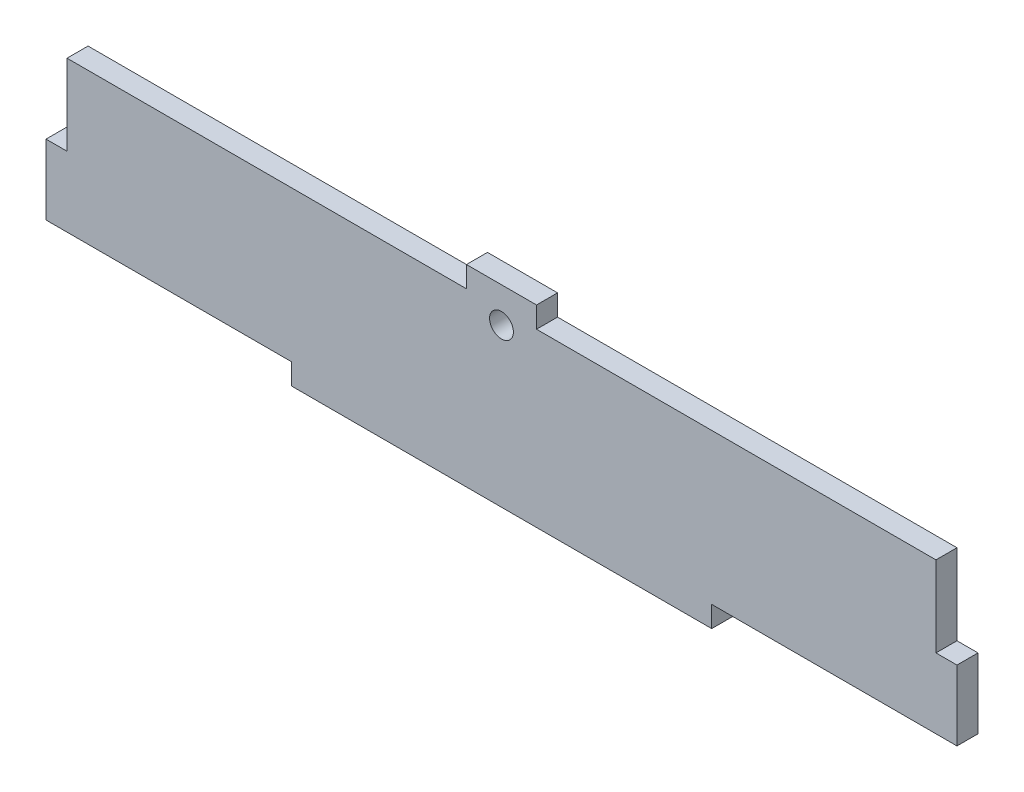
ISO-10303-21;
HEADER;
FILE_DESCRIPTION(('STEP AP214'),'2;1');
FILE_NAME('part.step','',(''),(''),'','','');
FILE_SCHEMA(('AUTOMOTIVE_DESIGN { 1 0 10303 214 1 1 1 1 }'));
ENDSEC;
DATA;
#1=APPLICATION_CONTEXT('core data for automotive mechanical design processes');
#2=APPLICATION_PROTOCOL_DEFINITION('international standard','automotive_design',2000,#1);
#3=PRODUCT_CONTEXT('',#1,'mechanical');
#4=PRODUCT('Part','Part','',(#3));
#5=PRODUCT_RELATED_PRODUCT_CATEGORY('part','',(#4));
#6=PRODUCT_DEFINITION_FORMATION('','',#4);
#7=PRODUCT_DEFINITION_CONTEXT('part definition',#1,'design');
#8=PRODUCT_DEFINITION('design','',#6,#7);
#9=PRODUCT_DEFINITION_SHAPE('','',#8);
#10=(LENGTH_UNIT() NAMED_UNIT(*) SI_UNIT(.MILLI.,.METRE.));
#11=(NAMED_UNIT(*) PLANE_ANGLE_UNIT() SI_UNIT($,.RADIAN.));
#12=(NAMED_UNIT(*) SI_UNIT($,.STERADIAN.) SOLID_ANGLE_UNIT());
#13=UNCERTAINTY_MEASURE_WITH_UNIT(LENGTH_MEASURE(1.E-05),#10,'distance_accuracy_value','');
#14=(GEOMETRIC_REPRESENTATION_CONTEXT(3) GLOBAL_UNCERTAINTY_ASSIGNED_CONTEXT((#13)) GLOBAL_UNIT_ASSIGNED_CONTEXT((#10,
#11,#12)) REPRESENTATION_CONTEXT('',''));
#15=CARTESIAN_POINT('',(0.,0.,0.));
#16=DIRECTION('',(0.,0.,1.));
#17=DIRECTION('',(1.,0.,0.));
#18=AXIS2_PLACEMENT_3D('',#15,#16,#17);
#19=CARTESIAN_POINT('',(130.,0.,6.));
#20=DIRECTION('',(0.,1.,0.));
#21=DIRECTION('',(0.,0.,1.));
#22=AXIS2_PLACEMENT_3D('',#19,#20,#21);
#23=PLANE('',#22);
#24=DIRECTION('',(0.,0.,-1.));
#25=VECTOR('',#24,1.);
#26=CARTESIAN_POINT('',(-60.,0.,6.));
#27=LINE('',#26,#25);
#28=CARTESIAN_POINT('',(-60.,0.,6.));
#29=VERTEX_POINT('',#28);
#30=CARTESIAN_POINT('',(-60.,0.,0.));
#31=VERTEX_POINT('',#30);
#32=EDGE_CURVE('E267',#29,#31,#27,.T.);
#33=ORIENTED_EDGE('',*,*,#32,.F.);
#34=DIRECTION('',(1.,0.,0.));
#35=VECTOR('',#34,1.);
#36=CARTESIAN_POINT('',(130.,0.,6.));
#37=LINE('',#36,#35);
#38=CARTESIAN_POINT('',(-130.,0.,6.));
#39=VERTEX_POINT('',#38);
#40=EDGE_CURVE('E231',#39,#29,#37,.T.);
#41=ORIENTED_EDGE('',*,*,#40,.F.);
#42=DIRECTION('',(0.,0.,-1.));
#43=VECTOR('',#42,1.);
#44=CARTESIAN_POINT('',(-130.,0.,6.));
#45=LINE('',#44,#43);
#46=CARTESIAN_POINT('',(-130.,0.,0.));
#47=VERTEX_POINT('',#46);
#48=EDGE_CURVE('E12',#39,#47,#45,.T.);
#49=ORIENTED_EDGE('',*,*,#48,.T.);
#50=DIRECTION('',(1.,0.,0.));
#51=VECTOR('',#50,1.);
#52=CARTESIAN_POINT('',(130.,0.,0.));
#53=LINE('',#52,#51);
#54=EDGE_CURVE('E386',#47,#31,#53,.T.);
#55=ORIENTED_EDGE('',*,*,#54,.T.);
#56=EDGE_LOOP('',(#33,#41,#49,#55));
#57=FACE_BOUND('',#56,.T.);
#58=ADVANCED_FACE('F43',(#57),#23,.F.);
#59=CARTESIAN_POINT('',(130.,48.9999999999999,6.));
#60=DIRECTION('',(-1.,0.,0.));
#61=DIRECTION('',(0.,-1.,0.));
#62=AXIS2_PLACEMENT_3D('',#59,#60,#61);
#63=PLANE('',#62);
#64=DIRECTION('',(0.,1.,0.));
#65=VECTOR('',#64,1.);
#66=CARTESIAN_POINT('',(130.,48.9999999999999,0.));
#67=LINE('',#66,#65);
#68=CARTESIAN_POINT('',(130.,0.,0.));
#69=VERTEX_POINT('',#68);
#70=CARTESIAN_POINT('',(130.,20.,0.));
#71=VERTEX_POINT('',#70);
#72=EDGE_CURVE('E240',#69,#71,#67,.T.);
#73=ORIENTED_EDGE('',*,*,#72,.T.);
#74=DIRECTION('',(0.,0.,-1.));
#75=VECTOR('',#74,1.);
#76=CARTESIAN_POINT('',(130.,20.,6.001));
#77=LINE('',#76,#75);
#78=CARTESIAN_POINT('',(130.,20.,6.));
#79=VERTEX_POINT('',#78);
#80=EDGE_CURVE('E705',#79,#71,#77,.T.);
#81=ORIENTED_EDGE('',*,*,#80,.F.);
#82=DIRECTION('',(0.,1.,0.));
#83=VECTOR('',#82,1.);
#84=CARTESIAN_POINT('',(130.,48.9999999999999,6.));
#85=LINE('',#84,#83);
#86=CARTESIAN_POINT('',(130.,0.,6.));
#87=VERTEX_POINT('',#86);
#88=EDGE_CURVE('E355',#87,#79,#85,.T.);
#89=ORIENTED_EDGE('',*,*,#88,.F.);
#90=DIRECTION('',(0.,0.,-1.));
#91=VECTOR('',#90,1.);
#92=CARTESIAN_POINT('',(130.,0.,6.));
#93=LINE('',#92,#91);
#94=EDGE_CURVE('E53',#87,#69,#93,.T.);
#95=ORIENTED_EDGE('',*,*,#94,.T.);
#96=EDGE_LOOP('',(#73,#81,#89,#95));
#97=FACE_BOUND('',#96,.T.);
#98=ADVANCED_FACE('F46',(#97),#63,.F.);
#99=CARTESIAN_POINT('',(130.,48.9999999999999,6.));
#100=DIRECTION('',(0.,-1.,0.));
#101=DIRECTION('',(0.,0.,-1.));
#102=AXIS2_PLACEMENT_3D('',#99,#100,#101);
#103=PLANE('',#102);
#104=DIRECTION('',(-1.,0.,0.));
#105=VECTOR('',#104,1.);
#106=CARTESIAN_POINT('',(130.,48.9999999999999,6.));
#107=LINE('',#106,#105);
#108=CARTESIAN_POINT('',(10.,48.9999999999999,6.));
#109=VERTEX_POINT('',#108);
#110=CARTESIAN_POINT('',(-10.,48.9999999999999,6.));
#111=VERTEX_POINT('',#110);
#112=EDGE_CURVE('E420',#109,#111,#107,.T.);
#113=ORIENTED_EDGE('',*,*,#112,.F.);
#114=DIRECTION('',(0.,0.,-1.));
#115=VECTOR('',#114,1.);
#116=CARTESIAN_POINT('',(10.,48.9999999999999,6.));
#117=LINE('',#116,#115);
#118=CARTESIAN_POINT('',(10.,48.9999999999999,0.));
#119=VERTEX_POINT('',#118);
#120=EDGE_CURVE('E330',#109,#119,#117,.T.);
#121=ORIENTED_EDGE('',*,*,#120,.T.);
#122=DIRECTION('',(-1.,0.,0.));
#123=VECTOR('',#122,1.);
#124=CARTESIAN_POINT('',(130.,48.9999999999999,0.));
#125=LINE('',#124,#123);
#126=CARTESIAN_POINT('',(-10.,48.9999999999999,0.));
#127=VERTEX_POINT('',#126);
#128=EDGE_CURVE('E378',#119,#127,#125,.T.);
#129=ORIENTED_EDGE('',*,*,#128,.T.);
#130=DIRECTION('',(0.,0.,-1.));
#131=VECTOR('',#130,1.);
#132=CARTESIAN_POINT('',(-10.,48.9999999999999,6.));
#133=LINE('',#132,#131);
#134=EDGE_CURVE('E316',#111,#127,#133,.T.);
#135=ORIENTED_EDGE('',*,*,#134,.F.);
#136=EDGE_LOOP('',(#113,#121,#129,#135));
#137=FACE_BOUND('',#136,.T.);
#138=ADVANCED_FACE('F417',(#137),#103,.F.);
#139=CARTESIAN_POINT('',(-130.,48.9999999999999,6.));
#140=DIRECTION('',(1.,0.,0.));
#141=DIRECTION('',(0.,1.,0.));
#142=AXIS2_PLACEMENT_3D('',#139,#140,#141);
#143=PLANE('',#142);
#144=DIRECTION('',(0.,-1.,0.));
#145=VECTOR('',#144,1.);
#146=CARTESIAN_POINT('',(-130.,48.9999999999999,6.));
#147=LINE('',#146,#145);
#148=CARTESIAN_POINT('',(-130.,20.,6.));
#149=VERTEX_POINT('',#148);
#150=EDGE_CURVE('E237',#149,#39,#147,.T.);
#151=ORIENTED_EDGE('',*,*,#150,.F.);
#152=DIRECTION('',(0.,0.,-1.));
#153=VECTOR('',#152,1.);
#154=CARTESIAN_POINT('',(-130.,20.,6.001));
#155=LINE('',#154,#153);
#156=CARTESIAN_POINT('',(-130.,20.,0.));
#157=VERTEX_POINT('',#156);
#158=EDGE_CURVE('E286',#149,#157,#155,.T.);
#159=ORIENTED_EDGE('',*,*,#158,.T.);
#160=DIRECTION('',(0.,-1.,0.));
#161=VECTOR('',#160,1.);
#162=CARTESIAN_POINT('',(-130.,48.9999999999999,0.));
#163=LINE('',#162,#161);
#164=EDGE_CURVE('E382',#157,#47,#163,.T.);
#165=ORIENTED_EDGE('',*,*,#164,.T.);
#166=ORIENTED_EDGE('',*,*,#48,.F.);
#167=EDGE_LOOP('',(#151,#159,#165,#166));
#168=FACE_BOUND('',#167,.T.);
#169=ADVANCED_FACE('F469',(#168),#143,.F.);
#170=CARTESIAN_POINT('',(60.,0.,6.));
#171=VERTEX_POINT('',#170);
#172=EDGE_CURVE('E236',#171,#87,#37,.T.);
#173=ORIENTED_EDGE('',*,*,#172,.F.);
#174=DIRECTION('',(0.,0.,-1.));
#175=VECTOR('',#174,1.);
#176=CARTESIAN_POINT('',(60.,0.,6.));
#177=LINE('',#176,#175);
#178=CARTESIAN_POINT('',(60.,0.,0.));
#179=VERTEX_POINT('',#178);
#180=EDGE_CURVE('E212',#171,#179,#177,.T.);
#181=ORIENTED_EDGE('',*,*,#180,.T.);
#182=EDGE_CURVE('E385',#179,#69,#53,.T.);
#183=ORIENTED_EDGE('',*,*,#182,.T.);
#184=ORIENTED_EDGE('',*,*,#94,.F.);
#185=EDGE_LOOP('',(#173,#181,#183,#184));
#186=FACE_BOUND('',#185,.T.);
#187=ADVANCED_FACE('F456',(#186),#23,.F.);
#188=CARTESIAN_POINT('',(0.,0.,6.));
#189=DIRECTION('',(0.,0.,-1.));
#190=DIRECTION('',(-1.,0.,0.));
#191=AXIS2_PLACEMENT_3D('',#188,#189,#190);
#192=PLANE('',#191);
#193=CARTESIAN_POINT('',(0.,39.,6.));
#194=DIRECTION('',(0.,0.,-1.));
#195=DIRECTION('',(-1.,0.,0.));
#196=AXIS2_PLACEMENT_3D('',#193,#194,#195);
#197=CIRCLE('',#196,3.4);
#198=CARTESIAN_POINT('',(-3.39999999999995,39.,6.));
#199=VERTEX_POINT('',#198);
#200=EDGE_CURVE('E304',#199,#199,#197,.T.);
#201=ORIENTED_EDGE('',*,*,#200,.T.);
#202=EDGE_LOOP('',(#201));
#203=FACE_BOUND('',#202,.T.);
#204=DIRECTION('',(1.,0.,0.));
#205=VECTOR('',#204,1.);
#206=CARTESIAN_POINT('',(130.,20.,6.));
#207=LINE('',#206,#205);
#208=CARTESIAN_POINT('',(124.,20.,6.));
#209=VERTEX_POINT('',#208);
#210=EDGE_CURVE('E374',#209,#79,#207,.T.);
#211=ORIENTED_EDGE('',*,*,#210,.F.);
#212=DIRECTION('',(0.,-1.,0.));
#213=VECTOR('',#212,1.);
#214=CARTESIAN_POINT('',(124.,43.,6.));
#215=LINE('',#214,#213);
#216=CARTESIAN_POINT('',(124.,43.,6.));
#217=VERTEX_POINT('',#216);
#218=EDGE_CURVE('E280',#217,#209,#215,.T.);
#219=ORIENTED_EDGE('',*,*,#218,.F.);
#220=DIRECTION('',(-1.,0.,0.));
#221=VECTOR('',#220,1.);
#222=CARTESIAN_POINT('',(130.,43.,6.));
#223=LINE('',#222,#221);
#224=CARTESIAN_POINT('',(10.,43.,6.));
#225=VERTEX_POINT('',#224);
#226=EDGE_CURVE('E298',#217,#225,#223,.T.);
#227=ORIENTED_EDGE('',*,*,#226,.T.);
#228=DIRECTION('',(0.,1.,0.));
#229=VECTOR('',#228,1.);
#230=CARTESIAN_POINT('',(10.,48.9999999999999,6.));
#231=LINE('',#230,#229);
#232=EDGE_CURVE('E302',#225,#109,#231,.T.);
#233=ORIENTED_EDGE('',*,*,#232,.T.);
#234=ORIENTED_EDGE('',*,*,#112,.T.);
#235=DIRECTION('',(0.,-1.,0.));
#236=VECTOR('',#235,1.);
#237=CARTESIAN_POINT('',(-10.,43.,6.));
#238=LINE('',#237,#236);
#239=CARTESIAN_POINT('',(-10.,43.,6.));
#240=VERTEX_POINT('',#239);
#241=EDGE_CURVE('E332',#111,#240,#238,.T.);
#242=ORIENTED_EDGE('',*,*,#241,.T.);
#243=DIRECTION('',(-1.,0.,0.));
#244=VECTOR('',#243,1.);
#245=CARTESIAN_POINT('',(-10.,43.,6.));
#246=LINE('',#245,#244);
#247=CARTESIAN_POINT('',(-124.,43.,6.));
#248=VERTEX_POINT('',#247);
#249=EDGE_CURVE('E337',#240,#248,#246,.T.);
#250=ORIENTED_EDGE('',*,*,#249,.T.);
#251=DIRECTION('',(0.,1.,0.));
#252=VECTOR('',#251,1.);
#253=CARTESIAN_POINT('',(-124.,43.,6.));
#254=LINE('',#253,#252);
#255=CARTESIAN_POINT('',(-124.,20.,6.));
#256=VERTEX_POINT('',#255);
#257=EDGE_CURVE('E74',#256,#248,#254,.T.);
#258=ORIENTED_EDGE('',*,*,#257,.F.);
#259=DIRECTION('',(1.,0.,0.));
#260=VECTOR('',#259,1.);
#261=CARTESIAN_POINT('',(-130.,20.,6.));
#262=LINE('',#261,#260);
#263=EDGE_CURVE('E486',#149,#256,#262,.T.);
#264=ORIENTED_EDGE('',*,*,#263,.F.);
#265=ORIENTED_EDGE('',*,*,#150,.T.);
#266=ORIENTED_EDGE('',*,*,#40,.T.);
#267=DIRECTION('',(0.,1.,0.));
#268=VECTOR('',#267,1.);
#269=CARTESIAN_POINT('',(-60.,0.,6.));
#270=LINE('',#269,#268);
#271=CARTESIAN_POINT('',(-60.,-5.99999999999998,6.));
#272=VERTEX_POINT('',#271);
#273=EDGE_CURVE('E199',#272,#29,#270,.T.);
#274=ORIENTED_EDGE('',*,*,#273,.F.);
#275=DIRECTION('',(-1.,0.,0.));
#276=VECTOR('',#275,1.);
#277=CARTESIAN_POINT('',(60.,-6.,6.));
#278=LINE('',#277,#276);
#279=CARTESIAN_POINT('',(60.,-6.,6.));
#280=VERTEX_POINT('',#279);
#281=EDGE_CURVE('E193',#280,#272,#278,.T.);
#282=ORIENTED_EDGE('',*,*,#281,.F.);
#283=DIRECTION('',(0.,-1.,0.));
#284=VECTOR('',#283,1.);
#285=CARTESIAN_POINT('',(60.,0.,6.));
#286=LINE('',#285,#284);
#287=EDGE_CURVE('E206',#171,#280,#286,.T.);
#288=ORIENTED_EDGE('',*,*,#287,.F.);
#289=ORIENTED_EDGE('',*,*,#172,.T.);
#290=ORIENTED_EDGE('',*,*,#88,.T.);
#291=EDGE_LOOP('',(#211,#219,#227,#233,#234,#242,#250,#258,#264,#265,#266,#274,#282,#288,#289,#290));
#292=FACE_BOUND('',#291,.T.);
#293=ADVANCED_FACE('F205',(#203,#292),#192,.F.);
#294=CARTESIAN_POINT('',(0.,0.,0.));
#295=DIRECTION('',(0.,0.,-1.));
#296=DIRECTION('',(-1.,0.,0.));
#297=AXIS2_PLACEMENT_3D('',#294,#295,#296);
#298=PLANE('',#297);
#299=DIRECTION('',(0.,1.,0.));
#300=VECTOR('',#299,1.);
#301=CARTESIAN_POINT('',(124.,43.,0.));
#302=LINE('',#301,#300);
#303=CARTESIAN_POINT('',(124.,20.,0.));
#304=VERTEX_POINT('',#303);
#305=CARTESIAN_POINT('',(124.,43.,0.));
#306=VERTEX_POINT('',#305);
#307=EDGE_CURVE('E702',#304,#306,#302,.T.);
#308=ORIENTED_EDGE('',*,*,#307,.F.);
#309=DIRECTION('',(-1.,0.,0.));
#310=VECTOR('',#309,1.);
#311=CARTESIAN_POINT('',(130.,20.,0.));
#312=LINE('',#311,#310);
#313=EDGE_CURVE('E285',#71,#304,#312,.T.);
#314=ORIENTED_EDGE('',*,*,#313,.F.);
#315=ORIENTED_EDGE('',*,*,#72,.F.);
#316=ORIENTED_EDGE('',*,*,#182,.F.);
#317=DIRECTION('',(0.,-1.,0.));
#318=VECTOR('',#317,1.);
#319=CARTESIAN_POINT('',(60.,0.,0.));
#320=LINE('',#319,#318);
#321=CARTESIAN_POINT('',(60.,-6.,0.));
#322=VERTEX_POINT('',#321);
#323=EDGE_CURVE('E63',#179,#322,#320,.T.);
#324=ORIENTED_EDGE('',*,*,#323,.T.);
#325=DIRECTION('',(-1.,0.,0.));
#326=VECTOR('',#325,1.);
#327=CARTESIAN_POINT('',(60.,-6.,0.));
#328=LINE('',#327,#326);
#329=CARTESIAN_POINT('',(-60.,-5.99999999999998,0.));
#330=VERTEX_POINT('',#329);
#331=EDGE_CURVE('E195',#322,#330,#328,.T.);
#332=ORIENTED_EDGE('',*,*,#331,.T.);
#333=DIRECTION('',(0.,1.,0.));
#334=VECTOR('',#333,1.);
#335=CARTESIAN_POINT('',(-60.,0.,0.));
#336=LINE('',#335,#334);
#337=EDGE_CURVE('E214',#330,#31,#336,.T.);
#338=ORIENTED_EDGE('',*,*,#337,.T.);
#339=ORIENTED_EDGE('',*,*,#54,.F.);
#340=ORIENTED_EDGE('',*,*,#164,.F.);
#341=DIRECTION('',(-1.,0.,0.));
#342=VECTOR('',#341,1.);
#343=CARTESIAN_POINT('',(-130.,20.,0.));
#344=LINE('',#343,#342);
#345=CARTESIAN_POINT('',(-124.,20.,0.));
#346=VERTEX_POINT('',#345);
#347=EDGE_CURVE('E367',#346,#157,#344,.T.);
#348=ORIENTED_EDGE('',*,*,#347,.F.);
#349=DIRECTION('',(0.,-1.,0.));
#350=VECTOR('',#349,1.);
#351=CARTESIAN_POINT('',(-124.,43.,0.));
#352=LINE('',#351,#350);
#353=CARTESIAN_POINT('',(-124.,43.,0.));
#354=VERTEX_POINT('',#353);
#355=EDGE_CURVE('E491',#354,#346,#352,.T.);
#356=ORIENTED_EDGE('',*,*,#355,.F.);
#357=DIRECTION('',(-1.,0.,0.));
#358=VECTOR('',#357,1.);
#359=CARTESIAN_POINT('',(-10.,43.,0.));
#360=LINE('',#359,#358);
#361=CARTESIAN_POINT('',(-10.,43.,0.));
#362=VERTEX_POINT('',#361);
#363=EDGE_CURVE('E338',#362,#354,#360,.T.);
#364=ORIENTED_EDGE('',*,*,#363,.F.);
#365=DIRECTION('',(0.,-1.,0.));
#366=VECTOR('',#365,1.);
#367=CARTESIAN_POINT('',(-10.,43.,0.));
#368=LINE('',#367,#366);
#369=EDGE_CURVE('E427',#127,#362,#368,.T.);
#370=ORIENTED_EDGE('',*,*,#369,.F.);
#371=ORIENTED_EDGE('',*,*,#128,.F.);
#372=DIRECTION('',(0.,1.,0.));
#373=VECTOR('',#372,1.);
#374=CARTESIAN_POINT('',(10.,48.9999999999999,0.));
#375=LINE('',#374,#373);
#376=CARTESIAN_POINT('',(10.,43.,0.));
#377=VERTEX_POINT('',#376);
#378=EDGE_CURVE('E303',#377,#119,#375,.T.);
#379=ORIENTED_EDGE('',*,*,#378,.F.);
#380=DIRECTION('',(-1.,0.,0.));
#381=VECTOR('',#380,1.);
#382=CARTESIAN_POINT('',(130.,43.,0.));
#383=LINE('',#382,#381);
#384=EDGE_CURVE('E312',#306,#377,#383,.T.);
#385=ORIENTED_EDGE('',*,*,#384,.F.);
#386=EDGE_LOOP('',(#308,#314,#315,#316,#324,#332,#338,#339,#340,#348,#356,#364,#370,#371,#379,#385));
#387=FACE_BOUND('',#386,.T.);
#388=CARTESIAN_POINT('',(0.,39.,0.));
#389=DIRECTION('',(0.,0.,-1.));
#390=DIRECTION('',(-1.,0.,0.));
#391=AXIS2_PLACEMENT_3D('',#388,#389,#390);
#392=CIRCLE('',#391,3.39999999999999);
#393=CARTESIAN_POINT('',(-3.39999999999995,39.,0.));
#394=VERTEX_POINT('',#393);
#395=EDGE_CURVE('E370',#394,#394,#392,.T.);
#396=ORIENTED_EDGE('',*,*,#395,.F.);
#397=EDGE_LOOP('',(#396));
#398=FACE_BOUND('',#397,.T.);
#399=ADVANCED_FACE('F406',(#387,#398),#298,.T.);
#400=CARTESIAN_POINT('',(-10.,43.,6.));
#401=DIRECTION('',(1.,0.,0.));
#402=DIRECTION('',(0.,0.,-1.));
#403=AXIS2_PLACEMENT_3D('',#400,#401,#402);
#404=PLANE('',#403);
#405=ORIENTED_EDGE('',*,*,#369,.T.);
#406=DIRECTION('',(0.,0.,-1.));
#407=VECTOR('',#406,1.);
#408=CARTESIAN_POINT('',(-10.,43.,6.));
#409=LINE('',#408,#407);
#410=EDGE_CURVE('E350',#240,#362,#409,.T.);
#411=ORIENTED_EDGE('',*,*,#410,.F.);
#412=ORIENTED_EDGE('',*,*,#241,.F.);
#413=ORIENTED_EDGE('',*,*,#134,.T.);
#414=EDGE_LOOP('',(#405,#411,#412,#413));
#415=FACE_BOUND('',#414,.T.);
#416=ADVANCED_FACE('F448',(#415),#404,.F.);
#417=CARTESIAN_POINT('',(-10.,43.,6.));
#418=DIRECTION('',(0.,-1.,0.));
#419=DIRECTION('',(0.,0.,-1.));
#420=AXIS2_PLACEMENT_3D('',#417,#418,#419);
#421=PLANE('',#420);
#422=ORIENTED_EDGE('',*,*,#363,.T.);
#423=DIRECTION('',(0.,0.,-1.));
#424=VECTOR('',#423,1.);
#425=CARTESIAN_POINT('',(-124.,43.,6.001));
#426=LINE('',#425,#424);
#427=EDGE_CURVE('E362',#248,#354,#426,.T.);
#428=ORIENTED_EDGE('',*,*,#427,.F.);
#429=ORIENTED_EDGE('',*,*,#249,.F.);
#430=ORIENTED_EDGE('',*,*,#410,.T.);
#431=EDGE_LOOP('',(#422,#428,#429,#430));
#432=FACE_BOUND('',#431,.T.);
#433=ADVANCED_FACE('F454',(#432),#421,.F.);
#434=CARTESIAN_POINT('',(10.,48.9999999999999,6.));
#435=DIRECTION('',(-1.,0.,0.));
#436=DIRECTION('',(0.,0.,1.));
#437=AXIS2_PLACEMENT_3D('',#434,#435,#436);
#438=PLANE('',#437);
#439=ORIENTED_EDGE('',*,*,#378,.T.);
#440=ORIENTED_EDGE('',*,*,#120,.F.);
#441=ORIENTED_EDGE('',*,*,#232,.F.);
#442=DIRECTION('',(0.,0.,-1.));
#443=VECTOR('',#442,1.);
#444=CARTESIAN_POINT('',(10.,43.,6.));
#445=LINE('',#444,#443);
#446=EDGE_CURVE('E311',#225,#377,#445,.T.);
#447=ORIENTED_EDGE('',*,*,#446,.T.);
#448=EDGE_LOOP('',(#439,#440,#441,#447));
#449=FACE_BOUND('',#448,.T.);
#450=ADVANCED_FACE('F550',(#449),#438,.F.);
#451=CARTESIAN_POINT('',(130.,43.,6.));
#452=DIRECTION('',(0.,-1.,0.));
#453=DIRECTION('',(0.,0.,-1.));
#454=AXIS2_PLACEMENT_3D('',#451,#452,#453);
#455=PLANE('',#454);
#456=ORIENTED_EDGE('',*,*,#226,.F.);
#457=DIRECTION('',(0.,0.,-1.));
#458=VECTOR('',#457,1.);
#459=CARTESIAN_POINT('',(124.,43.,6.001));
#460=LINE('',#459,#458);
#461=EDGE_CURVE('E699',#217,#306,#460,.T.);
#462=ORIENTED_EDGE('',*,*,#461,.T.);
#463=ORIENTED_EDGE('',*,*,#384,.T.);
#464=ORIENTED_EDGE('',*,*,#446,.F.);
#465=EDGE_LOOP('',(#456,#462,#463,#464));
#466=FACE_BOUND('',#465,.T.);
#467=ADVANCED_FACE('F444',(#466),#455,.F.);
#468=CARTESIAN_POINT('',(0.,39.,0.));
#469=DIRECTION('',(0.,0.,-1.));
#470=DIRECTION('',(-1.,0.,0.));
#471=AXIS2_PLACEMENT_3D('',#468,#469,#470);
#472=CYLINDRICAL_SURFACE('',#471,3.39999999999999);
#473=ORIENTED_EDGE('',*,*,#200,.F.);
#474=EDGE_LOOP('',(#473));
#475=FACE_BOUND('',#474,.T.);
#476=ORIENTED_EDGE('',*,*,#395,.T.);
#477=EDGE_LOOP('',(#476));
#478=FACE_BOUND('',#477,.T.);
#479=ADVANCED_FACE('F440',(#475,#478),#472,.F.);
#480=CARTESIAN_POINT('',(124.,43.,6.001));
#481=DIRECTION('',(-1.,0.,0.));
#482=DIRECTION('',(0.,0.,1.));
#483=AXIS2_PLACEMENT_3D('',#480,#481,#482);
#484=PLANE('',#483);
#485=ORIENTED_EDGE('',*,*,#218,.T.);
#486=DIRECTION('',(0.,0.,-1.));
#487=VECTOR('',#486,1.);
#488=CARTESIAN_POINT('',(124.,20.,6.001));
#489=LINE('',#488,#487);
#490=EDGE_CURVE('E701',#209,#304,#489,.T.);
#491=ORIENTED_EDGE('',*,*,#490,.T.);
#492=ORIENTED_EDGE('',*,*,#307,.T.);
#493=ORIENTED_EDGE('',*,*,#461,.F.);
#494=EDGE_LOOP('',(#485,#491,#492,#493));
#495=FACE_BOUND('',#494,.T.);
#496=ADVANCED_FACE('F443',(#495),#484,.F.);
#497=CARTESIAN_POINT('',(130.,20.,6.001));
#498=DIRECTION('',(0.,-1.,0.));
#499=DIRECTION('',(0.,0.,-1.));
#500=AXIS2_PLACEMENT_3D('',#497,#498,#499);
#501=PLANE('',#500);
#502=ORIENTED_EDGE('',*,*,#210,.T.);
#503=ORIENTED_EDGE('',*,*,#80,.T.);
#504=ORIENTED_EDGE('',*,*,#313,.T.);
#505=ORIENTED_EDGE('',*,*,#490,.F.);
#506=EDGE_LOOP('',(#502,#503,#504,#505));
#507=FACE_BOUND('',#506,.T.);
#508=ADVANCED_FACE('F538',(#507),#501,.F.);
#509=CARTESIAN_POINT('',(-130.,20.,6.001));
#510=DIRECTION('',(0.,-1.,0.));
#511=DIRECTION('',(0.,0.,-1.));
#512=AXIS2_PLACEMENT_3D('',#509,#510,#511);
#513=PLANE('',#512);
#514=ORIENTED_EDGE('',*,*,#263,.T.);
#515=DIRECTION('',(0.,0.,-1.));
#516=VECTOR('',#515,1.);
#517=CARTESIAN_POINT('',(-124.,20.,6.001));
#518=LINE('',#517,#516);
#519=EDGE_CURVE('E366',#256,#346,#518,.T.);
#520=ORIENTED_EDGE('',*,*,#519,.T.);
#521=ORIENTED_EDGE('',*,*,#347,.T.);
#522=ORIENTED_EDGE('',*,*,#158,.F.);
#523=EDGE_LOOP('',(#514,#520,#521,#522));
#524=FACE_BOUND('',#523,.T.);
#525=ADVANCED_FACE('F506',(#524),#513,.F.);
#526=CARTESIAN_POINT('',(-124.,43.,6.001));
#527=DIRECTION('',(1.,0.,0.));
#528=DIRECTION('',(0.,0.,-1.));
#529=AXIS2_PLACEMENT_3D('',#526,#527,#528);
#530=PLANE('',#529);
#531=ORIENTED_EDGE('',*,*,#257,.T.);
#532=ORIENTED_EDGE('',*,*,#427,.T.);
#533=ORIENTED_EDGE('',*,*,#355,.T.);
#534=ORIENTED_EDGE('',*,*,#519,.F.);
#535=EDGE_LOOP('',(#531,#532,#533,#534));
#536=FACE_BOUND('',#535,.T.);
#537=ADVANCED_FACE('F508',(#536),#530,.F.);
#538=CARTESIAN_POINT('',(60.,0.,6.));
#539=DIRECTION('',(1.,0.,0.));
#540=DIRECTION('',(0.,0.,-1.));
#541=AXIS2_PLACEMENT_3D('',#538,#539,#540);
#542=PLANE('',#541);
#543=ORIENTED_EDGE('',*,*,#323,.F.);
#544=ORIENTED_EDGE('',*,*,#180,.F.);
#545=ORIENTED_EDGE('',*,*,#287,.T.);
#546=DIRECTION('',(0.,0.,-1.));
#547=VECTOR('',#546,1.);
#548=CARTESIAN_POINT('',(60.,-6.,6.));
#549=LINE('',#548,#547);
#550=EDGE_CURVE('E190',#280,#322,#549,.T.);
#551=ORIENTED_EDGE('',*,*,#550,.T.);
#552=EDGE_LOOP('',(#543,#544,#545,#551));
#553=FACE_BOUND('',#552,.T.);
#554=ADVANCED_FACE('F211',(#553),#542,.T.);
#555=CARTESIAN_POINT('',(-60.,0.,6.));
#556=DIRECTION('',(-1.,0.,0.));
#557=DIRECTION('',(0.,0.,1.));
#558=AXIS2_PLACEMENT_3D('',#555,#556,#557);
#559=PLANE('',#558);
#560=ORIENTED_EDGE('',*,*,#337,.F.);
#561=DIRECTION('',(0.,0.,-1.));
#562=VECTOR('',#561,1.);
#563=CARTESIAN_POINT('',(-60.,-5.99999999999998,6.));
#564=LINE('',#563,#562);
#565=EDGE_CURVE('E198',#272,#330,#564,.T.);
#566=ORIENTED_EDGE('',*,*,#565,.F.);
#567=ORIENTED_EDGE('',*,*,#273,.T.);
#568=ORIENTED_EDGE('',*,*,#32,.T.);
#569=EDGE_LOOP('',(#560,#566,#567,#568));
#570=FACE_BOUND('',#569,.T.);
#571=ADVANCED_FACE('F516',(#570),#559,.T.);
#572=CARTESIAN_POINT('',(60.,-6.,6.));
#573=DIRECTION('',(0.,-1.,0.));
#574=DIRECTION('',(1.,0.,0.));
#575=AXIS2_PLACEMENT_3D('',#572,#573,#574);
#576=PLANE('',#575);
#577=ORIENTED_EDGE('',*,*,#331,.F.);
#578=ORIENTED_EDGE('',*,*,#550,.F.);
#579=ORIENTED_EDGE('',*,*,#281,.T.);
#580=ORIENTED_EDGE('',*,*,#565,.T.);
#581=EDGE_LOOP('',(#577,#578,#579,#580));
#582=FACE_BOUND('',#581,.T.);
#583=ADVANCED_FACE('F192',(#582),#576,.T.);
#584=CLOSED_SHELL('',(#58,#98,#138,#169,#187,#293,#399,#416,#433,#450,#467,#479,#496,#508,#525,
#537,#554,#571,#583));
#585=MANIFOLD_SOLID_BREP('B2',#584);
#586=ADVANCED_BREP_SHAPE_REPRESENTATION('',(#18,#585),#14);
#587=SHAPE_DEFINITION_REPRESENTATION(#9,#586);
ENDSEC;
END-ISO-10303-21;
